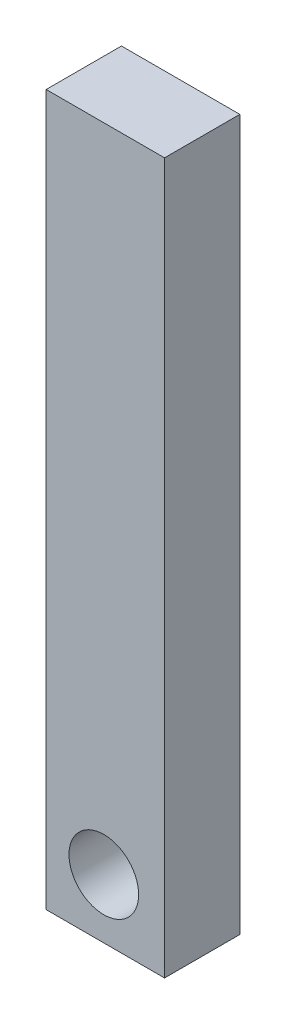
ISO-10303-21;
HEADER;
FILE_DESCRIPTION(('STEP AP214'),'2;1');
FILE_NAME('part.step','',(''),(''),'','','');
FILE_SCHEMA(('AUTOMOTIVE_DESIGN { 1 0 10303 214 1 1 1 1 }'));
ENDSEC;
DATA;
#1=APPLICATION_CONTEXT('core data for automotive mechanical design processes');
#2=APPLICATION_PROTOCOL_DEFINITION('international standard','automotive_design',2000,#1);
#3=PRODUCT_CONTEXT('',#1,'mechanical');
#4=PRODUCT('Part','Part','',(#3));
#5=PRODUCT_RELATED_PRODUCT_CATEGORY('part','',(#4));
#6=PRODUCT_DEFINITION_FORMATION('','',#4);
#7=PRODUCT_DEFINITION_CONTEXT('part definition',#1,'design');
#8=PRODUCT_DEFINITION('design','',#6,#7);
#9=PRODUCT_DEFINITION_SHAPE('','',#8);
#10=(LENGTH_UNIT() NAMED_UNIT(*) SI_UNIT(.MILLI.,.METRE.));
#11=(NAMED_UNIT(*) PLANE_ANGLE_UNIT() SI_UNIT($,.RADIAN.));
#12=(NAMED_UNIT(*) SI_UNIT($,.STERADIAN.) SOLID_ANGLE_UNIT());
#13=UNCERTAINTY_MEASURE_WITH_UNIT(LENGTH_MEASURE(1.E-05),#10,'distance_accuracy_value','');
#14=(GEOMETRIC_REPRESENTATION_CONTEXT(3) GLOBAL_UNCERTAINTY_ASSIGNED_CONTEXT((#13)) GLOBAL_UNIT_ASSIGNED_CONTEXT((#10,
#11,#12)) REPRESENTATION_CONTEXT('',''));
#15=CARTESIAN_POINT('',(0.,0.,0.));
#16=DIRECTION('',(0.,0.,1.));
#17=DIRECTION('',(1.,0.,0.));
#18=AXIS2_PLACEMENT_3D('',#15,#16,#17);
#19=CARTESIAN_POINT('',(0.,0.,3.18));
#20=DIRECTION('',(0.,0.,-1.));
#21=DIRECTION('',(-1.,0.,0.));
#22=AXIS2_PLACEMENT_3D('',#19,#20,#21);
#23=PLANE('',#22);
#24=DIRECTION('',(0.,-1.,0.));
#25=VECTOR('',#24,1.);
#26=CARTESIAN_POINT('',(0.,0.,3.18));
#27=LINE('',#26,#25);
#28=CARTESIAN_POINT('',(0.,30.,3.18));
#29=VERTEX_POINT('',#28);
#30=CARTESIAN_POINT('',(0.,0.,3.18));
#31=VERTEX_POINT('',#30);
#32=EDGE_CURVE('E92',#29,#31,#27,.T.);
#33=ORIENTED_EDGE('',*,*,#32,.T.);
#34=DIRECTION('',(1.,0.,0.));
#35=VECTOR('',#34,1.);
#36=CARTESIAN_POINT('',(0.,0.,3.18));
#37=LINE('',#36,#35);
#38=CARTESIAN_POINT('',(5.,0.,3.18));
#39=VERTEX_POINT('',#38);
#40=EDGE_CURVE('E87',#31,#39,#37,.T.);
#41=ORIENTED_EDGE('',*,*,#40,.T.);
#42=DIRECTION('',(0.,1.,0.));
#43=VECTOR('',#42,1.);
#44=CARTESIAN_POINT('',(5.,0.,3.18));
#45=LINE('',#44,#43);
#46=CARTESIAN_POINT('',(5.,30.,3.18));
#47=VERTEX_POINT('',#46);
#48=EDGE_CURVE('E90',#39,#47,#45,.T.);
#49=ORIENTED_EDGE('',*,*,#48,.T.);
#50=DIRECTION('',(-1.,0.,0.));
#51=VECTOR('',#50,1.);
#52=CARTESIAN_POINT('',(0.,30.,3.18));
#53=LINE('',#52,#51);
#54=EDGE_CURVE('E57',#47,#29,#53,.T.);
#55=ORIENTED_EDGE('',*,*,#54,.T.);
#56=EDGE_LOOP('',(#33,#41,#49,#55));
#57=FACE_BOUND('',#56,.T.);
#58=CARTESIAN_POINT('',(2.43509933037599,2.5,3.18));
#59=DIRECTION('',(0.,0.,1.));
#60=DIRECTION('',(1.,0.,0.));
#61=AXIS2_PLACEMENT_3D('',#58,#59,#60);
#62=CIRCLE('',#61,1.47);
#63=CARTESIAN_POINT('',(0.965099330375993,2.5,3.18));
#64=VERTEX_POINT('',#63);
#65=EDGE_CURVE('E112',#64,#64,#62,.T.);
#66=ORIENTED_EDGE('',*,*,#65,.F.);
#67=EDGE_LOOP('',(#66));
#68=FACE_BOUND('',#67,.T.);
#69=ADVANCED_FACE('F39',(#57,#68),#23,.F.);
#70=CARTESIAN_POINT('',(0.,0.,0.));
#71=DIRECTION('',(0.,0.,-1.));
#72=DIRECTION('',(-1.,0.,0.));
#73=AXIS2_PLACEMENT_3D('',#70,#71,#72);
#74=PLANE('',#73);
#75=DIRECTION('',(0.,-1.,0.));
#76=VECTOR('',#75,1.);
#77=CARTESIAN_POINT('',(0.,0.,0.));
#78=LINE('',#77,#76);
#79=CARTESIAN_POINT('',(0.,30.,0.));
#80=VERTEX_POINT('',#79);
#81=CARTESIAN_POINT('',(0.,0.,0.));
#82=VERTEX_POINT('',#81);
#83=EDGE_CURVE('E108',#80,#82,#78,.T.);
#84=ORIENTED_EDGE('',*,*,#83,.F.);
#85=DIRECTION('',(-1.,0.,0.));
#86=VECTOR('',#85,1.);
#87=CARTESIAN_POINT('',(0.,30.,0.));
#88=LINE('',#87,#86);
#89=CARTESIAN_POINT('',(5.,30.,0.));
#90=VERTEX_POINT('',#89);
#91=EDGE_CURVE('E80',#90,#80,#88,.T.);
#92=ORIENTED_EDGE('',*,*,#91,.F.);
#93=DIRECTION('',(0.,1.,0.));
#94=VECTOR('',#93,1.);
#95=CARTESIAN_POINT('',(5.,0.,0.));
#96=LINE('',#95,#94);
#97=CARTESIAN_POINT('',(5.,0.,0.));
#98=VERTEX_POINT('',#97);
#99=EDGE_CURVE('E74',#98,#90,#96,.T.);
#100=ORIENTED_EDGE('',*,*,#99,.F.);
#101=DIRECTION('',(1.,0.,0.));
#102=VECTOR('',#101,1.);
#103=CARTESIAN_POINT('',(0.,0.,0.));
#104=LINE('',#103,#102);
#105=EDGE_CURVE('E97',#82,#98,#104,.T.);
#106=ORIENTED_EDGE('',*,*,#105,.F.);
#107=EDGE_LOOP('',(#84,#92,#100,#106));
#108=FACE_BOUND('',#107,.T.);
#109=CARTESIAN_POINT('',(2.43509933037599,2.5,0.));
#110=DIRECTION('',(0.,0.,1.));
#111=DIRECTION('',(1.,0.,0.));
#112=AXIS2_PLACEMENT_3D('',#109,#110,#111);
#113=CIRCLE('',#112,1.47);
#114=CARTESIAN_POINT('',(0.965099330375993,2.5,0.));
#115=VERTEX_POINT('',#114);
#116=EDGE_CURVE('E130',#115,#115,#113,.T.);
#117=ORIENTED_EDGE('',*,*,#116,.T.);
#118=EDGE_LOOP('',(#117));
#119=FACE_BOUND('',#118,.T.);
#120=ADVANCED_FACE('F125',(#108,#119),#74,.T.);
#121=CARTESIAN_POINT('',(0.,0.,3.18));
#122=DIRECTION('',(1.,0.,0.));
#123=DIRECTION('',(0.,0.,-1.));
#124=AXIS2_PLACEMENT_3D('',#121,#122,#123);
#125=PLANE('',#124);
#126=ORIENTED_EDGE('',*,*,#83,.T.);
#127=DIRECTION('',(0.,0.,-1.));
#128=VECTOR('',#127,1.);
#129=CARTESIAN_POINT('',(0.,0.,3.18));
#130=LINE('',#129,#128);
#131=EDGE_CURVE('E11',#31,#82,#130,.T.);
#132=ORIENTED_EDGE('',*,*,#131,.F.);
#133=ORIENTED_EDGE('',*,*,#32,.F.);
#134=DIRECTION('',(0.,0.,-1.));
#135=VECTOR('',#134,1.);
#136=CARTESIAN_POINT('',(0.,30.,3.18));
#137=LINE('',#136,#135);
#138=EDGE_CURVE('E104',#29,#80,#137,.T.);
#139=ORIENTED_EDGE('',*,*,#138,.T.);
#140=EDGE_LOOP('',(#126,#132,#133,#139));
#141=FACE_BOUND('',#140,.T.);
#142=ADVANCED_FACE('F41',(#141),#125,.F.);
#143=CARTESIAN_POINT('',(0.,0.,3.18));
#144=DIRECTION('',(0.,1.,0.));
#145=DIRECTION('',(0.,0.,1.));
#146=AXIS2_PLACEMENT_3D('',#143,#144,#145);
#147=PLANE('',#146);
#148=ORIENTED_EDGE('',*,*,#105,.T.);
#149=DIRECTION('',(0.,0.,-1.));
#150=VECTOR('',#149,1.);
#151=CARTESIAN_POINT('',(5.,0.,3.18));
#152=LINE('',#151,#150);
#153=EDGE_CURVE('E49',#39,#98,#152,.T.);
#154=ORIENTED_EDGE('',*,*,#153,.F.);
#155=ORIENTED_EDGE('',*,*,#40,.F.);
#156=ORIENTED_EDGE('',*,*,#131,.T.);
#157=EDGE_LOOP('',(#148,#154,#155,#156));
#158=FACE_BOUND('',#157,.T.);
#159=ADVANCED_FACE('F96',(#158),#147,.F.);
#160=CARTESIAN_POINT('',(5.,0.,3.18));
#161=DIRECTION('',(-1.,0.,0.));
#162=DIRECTION('',(0.,0.,1.));
#163=AXIS2_PLACEMENT_3D('',#160,#161,#162);
#164=PLANE('',#163);
#165=ORIENTED_EDGE('',*,*,#99,.T.);
#166=DIRECTION('',(0.,0.,-1.));
#167=VECTOR('',#166,1.);
#168=CARTESIAN_POINT('',(5.,30.,3.18));
#169=LINE('',#168,#167);
#170=EDGE_CURVE('E99',#47,#90,#169,.T.);
#171=ORIENTED_EDGE('',*,*,#170,.F.);
#172=ORIENTED_EDGE('',*,*,#48,.F.);
#173=ORIENTED_EDGE('',*,*,#153,.T.);
#174=EDGE_LOOP('',(#165,#171,#172,#173));
#175=FACE_BOUND('',#174,.T.);
#176=ADVANCED_FACE('F100',(#175),#164,.F.);
#177=CARTESIAN_POINT('',(0.,30.,3.18));
#178=DIRECTION('',(0.,-1.,0.));
#179=DIRECTION('',(0.,0.,-1.));
#180=AXIS2_PLACEMENT_3D('',#177,#178,#179);
#181=PLANE('',#180);
#182=ORIENTED_EDGE('',*,*,#91,.T.);
#183=ORIENTED_EDGE('',*,*,#138,.F.);
#184=ORIENTED_EDGE('',*,*,#54,.F.);
#185=ORIENTED_EDGE('',*,*,#170,.T.);
#186=EDGE_LOOP('',(#182,#183,#184,#185));
#187=FACE_BOUND('',#186,.T.);
#188=ADVANCED_FACE('F122',(#187),#181,.F.);
#189=CARTESIAN_POINT('',(2.43509933037599,2.5,3.18));
#190=DIRECTION('',(0.,0.,-1.));
#191=DIRECTION('',(-1.,0.,0.));
#192=AXIS2_PLACEMENT_3D('',#189,#190,#191);
#193=CYLINDRICAL_SURFACE('',#192,1.47);
#194=CARTESIAN_POINT('',(0.965099330375993,2.5,3.18));
#195=CARTESIAN_POINT('',(0.965099330375993,2.5,3.146875));
#196=CARTESIAN_POINT('',(0.965099330375993,2.5,3.11375));
#197=CARTESIAN_POINT('',(0.965099330375993,2.5,3.0475));
#198=CARTESIAN_POINT('',(0.965099330375993,2.5,3.014375));
#199=CARTESIAN_POINT('',(0.965099330375993,2.5,2.948125));
#200=CARTESIAN_POINT('',(0.965099330375993,2.5,2.915));
#201=CARTESIAN_POINT('',(0.965099330375993,2.5,2.84875));
#202=CARTESIAN_POINT('',(0.965099330375993,2.5,2.815625));
#203=CARTESIAN_POINT('',(0.965099330375993,2.5,2.749375));
#204=CARTESIAN_POINT('',(0.965099330375993,2.5,2.71625));
#205=CARTESIAN_POINT('',(0.965099330375993,2.5,2.65));
#206=CARTESIAN_POINT('',(0.965099330375993,2.5,2.616875));
#207=CARTESIAN_POINT('',(0.965099330375993,2.5,2.550625));
#208=CARTESIAN_POINT('',(0.965099330375993,2.5,2.5175));
#209=CARTESIAN_POINT('',(0.965099330375993,2.5,2.45125));
#210=CARTESIAN_POINT('',(0.965099330375993,2.5,2.418125));
#211=CARTESIAN_POINT('',(0.965099330375993,2.5,2.351875));
#212=CARTESIAN_POINT('',(0.965099330375993,2.5,2.31875));
#213=CARTESIAN_POINT('',(0.965099330375993,2.5,2.2525));
#214=CARTESIAN_POINT('',(0.965099330375993,2.5,2.219375));
#215=CARTESIAN_POINT('',(0.965099330375993,2.5,2.153125));
#216=CARTESIAN_POINT('',(0.965099330375993,2.5,2.12));
#217=CARTESIAN_POINT('',(0.965099330375993,2.5,2.05375));
#218=CARTESIAN_POINT('',(0.965099330375993,2.5,2.020625));
#219=CARTESIAN_POINT('',(0.965099330375993,2.5,1.954375));
#220=CARTESIAN_POINT('',(0.965099330375993,2.5,1.92125));
#221=CARTESIAN_POINT('',(0.965099330375993,2.5,1.855));
#222=CARTESIAN_POINT('',(0.965099330375993,2.5,1.821875));
#223=CARTESIAN_POINT('',(0.965099330375993,2.5,1.755625));
#224=CARTESIAN_POINT('',(0.965099330375993,2.5,1.7225));
#225=CARTESIAN_POINT('',(0.965099330375993,2.5,1.65625));
#226=CARTESIAN_POINT('',(0.965099330375993,2.5,1.623125));
#227=CARTESIAN_POINT('',(0.965099330375993,2.5,1.556875));
#228=CARTESIAN_POINT('',(0.965099330375993,2.5,1.52375));
#229=CARTESIAN_POINT('',(0.965099330375993,2.5,1.4575));
#230=CARTESIAN_POINT('',(0.965099330375993,2.5,1.424375));
#231=CARTESIAN_POINT('',(0.965099330375993,2.5,1.358125));
#232=CARTESIAN_POINT('',(0.965099330375993,2.5,1.325));
#233=CARTESIAN_POINT('',(0.965099330375993,2.5,1.25875));
#234=CARTESIAN_POINT('',(0.965099330375993,2.5,1.225625));
#235=CARTESIAN_POINT('',(0.965099330375993,2.5,1.159375));
#236=CARTESIAN_POINT('',(0.965099330375993,2.5,1.12625));
#237=CARTESIAN_POINT('',(0.965099330375993,2.5,1.06));
#238=CARTESIAN_POINT('',(0.965099330375993,2.5,1.026875));
#239=CARTESIAN_POINT('',(0.965099330375993,2.5,0.960625));
#240=CARTESIAN_POINT('',(0.965099330375993,2.5,0.9275));
#241=CARTESIAN_POINT('',(0.965099330375993,2.5,0.86125));
#242=CARTESIAN_POINT('',(0.965099330375993,2.5,0.828125));
#243=CARTESIAN_POINT('',(0.965099330375993,2.5,0.761875));
#244=CARTESIAN_POINT('',(0.965099330375993,2.5,0.72875));
#245=CARTESIAN_POINT('',(0.965099330375993,2.5,0.6625));
#246=CARTESIAN_POINT('',(0.965099330375993,2.5,0.629375));
#247=CARTESIAN_POINT('',(0.965099330375993,2.5,0.563125));
#248=CARTESIAN_POINT('',(0.965099330375993,2.5,0.53));
#249=CARTESIAN_POINT('',(0.965099330375993,2.5,0.46375));
#250=CARTESIAN_POINT('',(0.965099330375993,2.5,0.430625));
#251=CARTESIAN_POINT('',(0.965099330375993,2.5,0.364375));
#252=CARTESIAN_POINT('',(0.965099330375993,2.5,0.33125));
#253=CARTESIAN_POINT('',(0.965099330375993,2.5,0.265));
#254=CARTESIAN_POINT('',(0.965099330375993,2.5,0.231875));
#255=CARTESIAN_POINT('',(0.965099330375993,2.5,0.165625));
#256=CARTESIAN_POINT('',(0.965099330375993,2.5,0.1325));
#257=CARTESIAN_POINT('',(0.965099330375993,2.5,0.06625));
#258=CARTESIAN_POINT('',(0.965099330375993,2.5,0.033125));
#259=CARTESIAN_POINT('',(0.965099330375993,2.5,0.));
#260=B_SPLINE_CURVE_WITH_KNOTS('',3,(#194,#195,#196,#197,#198,#199,#200,#201,#202,#203,#204,
#205,#206,#207,#208,#209,#210,#211,#212,#213,#214,#215,#216,#217,#218,#219,#220,#221,#222,#223,
#224,#225,#226,#227,#228,#229,#230,#231,#232,#233,#234,#235,#236,#237,#238,#239,#240,#241,#242,
#243,#244,#245,#246,#247,#248,#249,#250,#251,#252,#253,#254,#255,#256,#257,#258,#259),
.UNSPECIFIED.,.F.,.F.,(4,2,2,2,2,2,2,2,2,2,2,2,2,2,2,2,2,2,2,2,2,2,2,2,2,2,2,2,2,2,2,2,4),(0.,
0.0993750000000001,0.19875,0.298125,0.3975,0.496875,0.59625,0.695625,0.795,0.894375,0.99375,
1.093125,1.1925,1.291875,1.39125,1.490625,1.59,1.689375,1.78875,1.888125,1.9875,2.086875,
2.18625,2.285625,2.385,2.484375,2.58375,2.683125,2.7825,2.881875,2.98125,3.080625,3.18),.UNSPECIFIED.);
#261=EDGE_CURVE('BSEAM138',#64,#115,#260,.T.);
#262=ORIENTED_EDGE('',*,*,#65,.T.);
#263=ORIENTED_EDGE('',*,*,#116,.F.);
#264=ORIENTED_EDGE('',*,*,#261,.T.);
#265=ORIENTED_EDGE('',*,*,#261,.F.);
#266=EDGE_LOOP('',(#262,#264,#263,#265));
#267=FACE_BOUND('',#266,.T.);
#268=ADVANCED_FACE('F138',(#267),#193,.F.);
#269=CLOSED_SHELL('',(#69,#120,#142,#159,#176,#188,#268));
#270=MANIFOLD_SOLID_BREP('B2',#269);
#271=ADVANCED_BREP_SHAPE_REPRESENTATION('',(#18,#270),#14);
#272=SHAPE_DEFINITION_REPRESENTATION(#9,#271);
ENDSEC;
END-ISO-10303-21;
